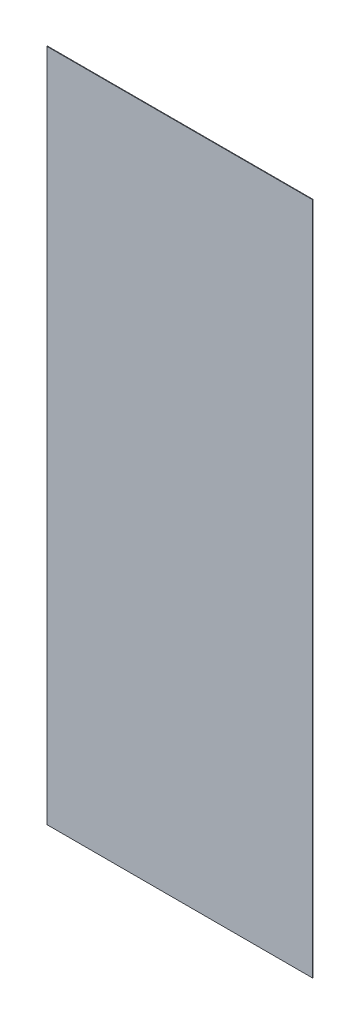
ISO-10303-21;
HEADER;
FILE_DESCRIPTION(('STEP AP214'),'2;1');
FILE_NAME('part.step','',(''),(''),'','','');
FILE_SCHEMA(('AUTOMOTIVE_DESIGN { 1 0 10303 214 1 1 1 1 }'));
ENDSEC;
DATA;
#1=APPLICATION_CONTEXT('core data for automotive mechanical design processes');
#2=APPLICATION_PROTOCOL_DEFINITION('international standard','automotive_design',2000,#1);
#3=PRODUCT_CONTEXT('',#1,'mechanical');
#4=PRODUCT('Part','Part','',(#3));
#5=PRODUCT_RELATED_PRODUCT_CATEGORY('part','',(#4));
#6=PRODUCT_DEFINITION_FORMATION('','',#4);
#7=PRODUCT_DEFINITION_CONTEXT('part definition',#1,'design');
#8=PRODUCT_DEFINITION('design','',#6,#7);
#9=PRODUCT_DEFINITION_SHAPE('','',#8);
#10=(LENGTH_UNIT() NAMED_UNIT(*) SI_UNIT(.MILLI.,.METRE.));
#11=(NAMED_UNIT(*) PLANE_ANGLE_UNIT() SI_UNIT($,.RADIAN.));
#12=(NAMED_UNIT(*) SI_UNIT($,.STERADIAN.) SOLID_ANGLE_UNIT());
#13=UNCERTAINTY_MEASURE_WITH_UNIT(LENGTH_MEASURE(1.E-05),#10,'distance_accuracy_value','');
#14=(GEOMETRIC_REPRESENTATION_CONTEXT(3) GLOBAL_UNCERTAINTY_ASSIGNED_CONTEXT((#13)) GLOBAL_UNIT_ASSIGNED_CONTEXT((#10,
#11,#12)) REPRESENTATION_CONTEXT('',''));
#15=CARTESIAN_POINT('',(0.,0.,0.));
#16=DIRECTION('',(0.,0.,1.));
#17=DIRECTION('',(1.,0.,0.));
#18=AXIS2_PLACEMENT_3D('',#15,#16,#17);
#19=CARTESIAN_POINT('',(1.5,200.,-820.));
#20=DIRECTION('',(-1.,0.,0.));
#21=DIRECTION('',(0.,0.,1.));
#22=AXIS2_PLACEMENT_3D('',#19,#20,#21);
#23=PLANE('',#22);
#24=DIRECTION('',(0.,-1.,0.));
#25=VECTOR('',#24,1.);
#26=CARTESIAN_POINT('',(1.5,200.,-818.5));
#27=LINE('',#26,#25);
#28=CARTESIAN_POINT('',(1.5,1968.5,-818.5));
#29=VERTEX_POINT('',#28);
#30=CARTESIAN_POINT('',(1.5,200.,-818.5));
#31=VERTEX_POINT('',#30);
#32=EDGE_CURVE('E103',#29,#31,#27,.T.);
#33=ORIENTED_EDGE('',*,*,#32,.F.);
#34=DIRECTION('',(0.,0.,1.));
#35=VECTOR('',#34,1.);
#36=CARTESIAN_POINT('',(1.5,1968.5,-820.));
#37=LINE('',#36,#35);
#38=CARTESIAN_POINT('',(1.5,1968.5,-820.));
#39=VERTEX_POINT('',#38);
#40=EDGE_CURVE('E11',#39,#29,#37,.T.);
#41=ORIENTED_EDGE('',*,*,#40,.F.);
#42=DIRECTION('',(0.,-1.,0.));
#43=VECTOR('',#42,1.);
#44=CARTESIAN_POINT('',(1.5,200.,-820.));
#45=LINE('',#44,#43);
#46=CARTESIAN_POINT('',(1.5,200.,-820.));
#47=VERTEX_POINT('',#46);
#48=EDGE_CURVE('E97',#39,#47,#45,.T.);
#49=ORIENTED_EDGE('',*,*,#48,.T.);
#50=DIRECTION('',(0.,0.,1.));
#51=VECTOR('',#50,1.);
#52=CARTESIAN_POINT('',(1.5,200.,-820.));
#53=LINE('',#52,#51);
#54=EDGE_CURVE('E42',#47,#31,#53,.T.);
#55=ORIENTED_EDGE('',*,*,#54,.T.);
#56=EDGE_LOOP('',(#33,#41,#49,#55));
#57=FACE_BOUND('',#56,.T.);
#58=ADVANCED_FACE('F39',(#57),#23,.T.);
#59=CARTESIAN_POINT('',(1.5,1968.5,-820.));
#60=DIRECTION('',(0.,1.,0.));
#61=DIRECTION('',(0.,0.,1.));
#62=AXIS2_PLACEMENT_3D('',#59,#60,#61);
#63=PLANE('',#62);
#64=DIRECTION('',(-1.,0.,0.));
#65=VECTOR('',#64,1.);
#66=CARTESIAN_POINT('',(1.5,1968.5,-818.5));
#67=LINE('',#66,#65);
#68=CARTESIAN_POINT('',(698.5,1968.5,-818.5));
#69=VERTEX_POINT('',#68);
#70=EDGE_CURVE('E99',#69,#29,#67,.T.);
#71=ORIENTED_EDGE('',*,*,#70,.F.);
#72=DIRECTION('',(0.,0.,1.));
#73=VECTOR('',#72,1.);
#74=CARTESIAN_POINT('',(698.5,1968.5,-820.));
#75=LINE('',#74,#73);
#76=CARTESIAN_POINT('',(698.5,1968.5,-820.));
#77=VERTEX_POINT('',#76);
#78=EDGE_CURVE('E48',#77,#69,#75,.T.);
#79=ORIENTED_EDGE('',*,*,#78,.F.);
#80=DIRECTION('',(-1.,0.,0.));
#81=VECTOR('',#80,1.);
#82=CARTESIAN_POINT('',(1.5,1968.5,-820.));
#83=LINE('',#82,#81);
#84=EDGE_CURVE('E94',#77,#39,#83,.T.);
#85=ORIENTED_EDGE('',*,*,#84,.T.);
#86=ORIENTED_EDGE('',*,*,#40,.T.);
#87=EDGE_LOOP('',(#71,#79,#85,#86));
#88=FACE_BOUND('',#87,.T.);
#89=ADVANCED_FACE('F113',(#88),#63,.T.);
#90=CARTESIAN_POINT('',(698.5,200.,-820.));
#91=DIRECTION('',(1.,0.,0.));
#92=DIRECTION('',(0.,0.,-1.));
#93=AXIS2_PLACEMENT_3D('',#90,#91,#92);
#94=PLANE('',#93);
#95=DIRECTION('',(0.,1.,0.));
#96=VECTOR('',#95,1.);
#97=CARTESIAN_POINT('',(698.5,200.,-818.5));
#98=LINE('',#97,#96);
#99=CARTESIAN_POINT('',(698.5,200.,-818.5));
#100=VERTEX_POINT('',#99);
#101=EDGE_CURVE('E89',#100,#69,#98,.T.);
#102=ORIENTED_EDGE('',*,*,#101,.F.);
#103=DIRECTION('',(0.,0.,1.));
#104=VECTOR('',#103,1.);
#105=CARTESIAN_POINT('',(698.5,200.,-820.));
#106=LINE('',#105,#104);
#107=CARTESIAN_POINT('',(698.5,200.,-820.));
#108=VERTEX_POINT('',#107);
#109=EDGE_CURVE('E84',#108,#100,#106,.T.);
#110=ORIENTED_EDGE('',*,*,#109,.F.);
#111=DIRECTION('',(0.,1.,0.));
#112=VECTOR('',#111,1.);
#113=CARTESIAN_POINT('',(698.5,200.,-820.));
#114=LINE('',#113,#112);
#115=EDGE_CURVE('E87',#108,#77,#114,.T.);
#116=ORIENTED_EDGE('',*,*,#115,.T.);
#117=ORIENTED_EDGE('',*,*,#78,.T.);
#118=EDGE_LOOP('',(#102,#110,#116,#117));
#119=FACE_BOUND('',#118,.T.);
#120=ADVANCED_FACE('F86',(#119),#94,.T.);
#121=CARTESIAN_POINT('',(1.5,200.,-820.));
#122=DIRECTION('',(0.,-1.,0.));
#123=DIRECTION('',(0.,0.,-1.));
#124=AXIS2_PLACEMENT_3D('',#121,#122,#123);
#125=PLANE('',#124);
#126=DIRECTION('',(1.,0.,0.));
#127=VECTOR('',#126,1.);
#128=CARTESIAN_POINT('',(1.5,200.,-818.5));
#129=LINE('',#128,#127);
#130=EDGE_CURVE('E106',#31,#100,#129,.T.);
#131=ORIENTED_EDGE('',*,*,#130,.F.);
#132=ORIENTED_EDGE('',*,*,#54,.F.);
#133=DIRECTION('',(1.,0.,0.));
#134=VECTOR('',#133,1.);
#135=CARTESIAN_POINT('',(1.5,200.,-820.));
#136=LINE('',#135,#134);
#137=EDGE_CURVE('E93',#47,#108,#136,.T.);
#138=ORIENTED_EDGE('',*,*,#137,.T.);
#139=ORIENTED_EDGE('',*,*,#109,.T.);
#140=EDGE_LOOP('',(#131,#132,#138,#139));
#141=FACE_BOUND('',#140,.T.);
#142=ADVANCED_FACE('F96',(#141),#125,.T.);
#143=CARTESIAN_POINT('',(0.,0.,-820.));
#144=DIRECTION('',(0.,0.,-1.));
#145=DIRECTION('',(-1.,0.,0.));
#146=AXIS2_PLACEMENT_3D('',#143,#144,#145);
#147=PLANE('',#146);
#148=ORIENTED_EDGE('',*,*,#48,.F.);
#149=ORIENTED_EDGE('',*,*,#84,.F.);
#150=ORIENTED_EDGE('',*,*,#115,.F.);
#151=ORIENTED_EDGE('',*,*,#137,.F.);
#152=EDGE_LOOP('',(#148,#149,#150,#151));
#153=FACE_BOUND('',#152,.T.);
#154=ADVANCED_FACE('F92',(#153),#147,.T.);
#155=CARTESIAN_POINT('',(0.,0.,-818.5));
#156=DIRECTION('',(0.,0.,-1.));
#157=DIRECTION('',(-1.,0.,0.));
#158=AXIS2_PLACEMENT_3D('',#155,#156,#157);
#159=PLANE('',#158);
#160=ORIENTED_EDGE('',*,*,#32,.T.);
#161=ORIENTED_EDGE('',*,*,#130,.T.);
#162=ORIENTED_EDGE('',*,*,#101,.T.);
#163=ORIENTED_EDGE('',*,*,#70,.T.);
#164=EDGE_LOOP('',(#160,#161,#162,#163));
#165=FACE_BOUND('',#164,.T.);
#166=ADVANCED_FACE('F112',(#165),#159,.F.);
#167=CLOSED_SHELL('',(#58,#89,#120,#142,#154,#166));
#168=MANIFOLD_SOLID_BREP('B2',#167);
#169=ADVANCED_BREP_SHAPE_REPRESENTATION('',(#18,#168),#14);
#170=SHAPE_DEFINITION_REPRESENTATION(#9,#169);
ENDSEC;
END-ISO-10303-21;
